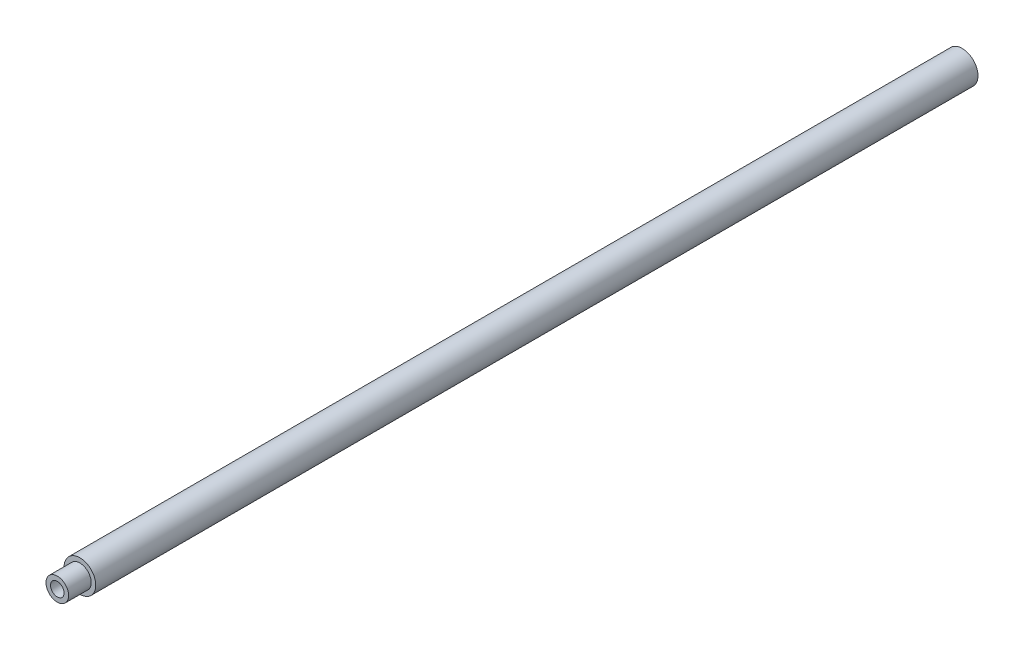
ISO-10303-21;
HEADER;
FILE_DESCRIPTION(('STEP AP214'),'2;1');
FILE_NAME('part.step','',(''),(''),'','','');
FILE_SCHEMA(('AUTOMOTIVE_DESIGN { 1 0 10303 214 1 1 1 1 }'));
ENDSEC;
DATA;
#1=APPLICATION_CONTEXT('core data for automotive mechanical design processes');
#2=APPLICATION_PROTOCOL_DEFINITION('international standard','automotive_design',2000,#1);
#3=PRODUCT_CONTEXT('',#1,'mechanical');
#4=PRODUCT('Part','Part','',(#3));
#5=PRODUCT_RELATED_PRODUCT_CATEGORY('part','',(#4));
#6=PRODUCT_DEFINITION_FORMATION('','',#4);
#7=PRODUCT_DEFINITION_CONTEXT('part definition',#1,'design');
#8=PRODUCT_DEFINITION('design','',#6,#7);
#9=PRODUCT_DEFINITION_SHAPE('','',#8);
#10=(LENGTH_UNIT() NAMED_UNIT(*) SI_UNIT(.MILLI.,.METRE.));
#11=(NAMED_UNIT(*) PLANE_ANGLE_UNIT() SI_UNIT($,.RADIAN.));
#12=(NAMED_UNIT(*) SI_UNIT($,.STERADIAN.) SOLID_ANGLE_UNIT());
#13=UNCERTAINTY_MEASURE_WITH_UNIT(LENGTH_MEASURE(1.E-05),#10,'distance_accuracy_value','');
#14=(GEOMETRIC_REPRESENTATION_CONTEXT(3) GLOBAL_UNCERTAINTY_ASSIGNED_CONTEXT((#13)) GLOBAL_UNIT_ASSIGNED_CONTEXT((#10,
#11,#12)) REPRESENTATION_CONTEXT('',''));
#15=CARTESIAN_POINT('',(0.,0.,0.));
#16=DIRECTION('',(0.,0.,1.));
#17=DIRECTION('',(1.,0.,0.));
#18=AXIS2_PLACEMENT_3D('',#15,#16,#17);
#19=CARTESIAN_POINT('',(0.,0.,200.));
#20=DIRECTION('',(0.,0.,-1.));
#21=DIRECTION('',(-1.,0.,0.));
#22=AXIS2_PLACEMENT_3D('',#19,#20,#21);
#23=CYLINDRICAL_SURFACE('',#22,3.5);
#24=CARTESIAN_POINT('',(0.,0.,0.));
#25=DIRECTION('',(0.,0.,1.));
#26=DIRECTION('',(1.,0.,0.));
#27=AXIS2_PLACEMENT_3D('',#24,#25,#26);
#28=CIRCLE('',#27,3.5);
#29=CARTESIAN_POINT('',(3.5,0.,0.));
#30=VERTEX_POINT('',#29);
#31=EDGE_CURVE('E10',#30,#30,#28,.T.);
#32=ORIENTED_EDGE('',*,*,#31,.T.);
#33=EDGE_LOOP('',(#32));
#34=FACE_BOUND('',#33,.T.);
#35=CARTESIAN_POINT('',(0.,0.,195.));
#36=DIRECTION('',(0.,0.,1.));
#37=DIRECTION('',(1.,0.,0.));
#38=AXIS2_PLACEMENT_3D('',#35,#36,#37);
#39=CIRCLE('',#38,3.5);
#40=CARTESIAN_POINT('',(3.5,0.,195.));
#41=VERTEX_POINT('',#40);
#42=EDGE_CURVE('E46',#41,#41,#39,.T.);
#43=ORIENTED_EDGE('',*,*,#42,.F.);
#44=EDGE_LOOP('',(#43));
#45=FACE_BOUND('',#44,.T.);
#46=ADVANCED_FACE('F31',(#34,#45),#23,.T.);
#47=CARTESIAN_POINT('',(0.,0.,0.));
#48=DIRECTION('',(0.,0.,1.));
#49=DIRECTION('',(1.,0.,0.));
#50=AXIS2_PLACEMENT_3D('',#47,#48,#49);
#51=PLANE('',#50);
#52=CARTESIAN_POINT('',(0.,0.,0.));
#53=DIRECTION('',(0.,0.,-1.));
#54=DIRECTION('',(-1.,0.,0.));
#55=AXIS2_PLACEMENT_3D('',#52,#53,#54);
#56=CIRCLE('',#55,2.);
#57=CARTESIAN_POINT('',(-2.,0.,0.));
#58=VERTEX_POINT('',#57);
#59=EDGE_CURVE('E41',#58,#58,#56,.T.);
#60=ORIENTED_EDGE('',*,*,#59,.F.);
#61=EDGE_LOOP('',(#60));
#62=FACE_BOUND('',#61,.T.);
#63=ORIENTED_EDGE('',*,*,#31,.F.);
#64=EDGE_LOOP('',(#63));
#65=FACE_BOUND('',#64,.T.);
#66=ADVANCED_FACE('F89',(#62,#65),#51,.F.);
#67=CARTESIAN_POINT('',(0.,0.,15.));
#68=DIRECTION('',(0.,0.,-1.));
#69=DIRECTION('',(-1.,0.,0.));
#70=AXIS2_PLACEMENT_3D('',#67,#68,#69);
#71=CYLINDRICAL_SURFACE('',#70,2.);
#72=CARTESIAN_POINT('',(0.,0.,15.));
#73=DIRECTION('',(0.,0.,-1.));
#74=DIRECTION('',(-1.,0.,0.));
#75=AXIS2_PLACEMENT_3D('',#72,#73,#74);
#76=CIRCLE('',#75,2.);
#77=CARTESIAN_POINT('',(-2.,0.,15.));
#78=VERTEX_POINT('',#77);
#79=EDGE_CURVE('E37',#78,#78,#76,.T.);
#80=ORIENTED_EDGE('',*,*,#79,.F.);
#81=EDGE_LOOP('',(#80));
#82=FACE_BOUND('',#81,.T.);
#83=ORIENTED_EDGE('',*,*,#59,.T.);
#84=EDGE_LOOP('',(#83));
#85=FACE_BOUND('',#84,.T.);
#86=ADVANCED_FACE('F95',(#82,#85),#71,.F.);
#87=CARTESIAN_POINT('',(0.,0.,15.));
#88=DIRECTION('',(0.,0.,-1.));
#89=DIRECTION('',(-1.,0.,0.));
#90=AXIS2_PLACEMENT_3D('',#87,#88,#89);
#91=PLANE('',#90);
#92=ORIENTED_EDGE('',*,*,#79,.T.);
#93=EDGE_LOOP('',(#92));
#94=FACE_BOUND('',#93,.T.);
#95=ADVANCED_FACE('F85',(#94),#91,.T.);
#96=CARTESIAN_POINT('',(0.,0.,195.));
#97=DIRECTION('',(0.,0.,1.));
#98=DIRECTION('',(1.,0.,0.));
#99=AXIS2_PLACEMENT_3D('',#96,#97,#98);
#100=PLANE('',#99);
#101=CARTESIAN_POINT('',(0.,0.,195.));
#102=DIRECTION('',(0.,0.,1.));
#103=DIRECTION('',(1.,0.,0.));
#104=AXIS2_PLACEMENT_3D('',#101,#102,#103);
#105=CIRCLE('',#104,2.5);
#106=CARTESIAN_POINT('',(2.5,0.,195.));
#107=VERTEX_POINT('',#106);
#108=EDGE_CURVE('E50',#107,#107,#105,.T.);
#109=ORIENTED_EDGE('',*,*,#108,.F.);
#110=EDGE_LOOP('',(#109));
#111=FACE_BOUND('',#110,.T.);
#112=ORIENTED_EDGE('',*,*,#42,.T.);
#113=EDGE_LOOP('',(#112));
#114=FACE_BOUND('',#113,.T.);
#115=ADVANCED_FACE('F79',(#111,#114),#100,.T.);
#116=CARTESIAN_POINT('',(0.,0.,195.));
#117=DIRECTION('',(0.,0.,1.));
#118=DIRECTION('',(1.,0.,0.));
#119=AXIS2_PLACEMENT_3D('',#116,#117,#118);
#120=CYLINDRICAL_SURFACE('',#119,2.5);
#121=ORIENTED_EDGE('',*,*,#108,.T.);
#122=EDGE_LOOP('',(#121));
#123=FACE_BOUND('',#122,.T.);
#124=CARTESIAN_POINT('',(0.,0.,200.));
#125=DIRECTION('',(0.,0.,1.));
#126=DIRECTION('',(1.,0.,0.));
#127=AXIS2_PLACEMENT_3D('',#124,#125,#126);
#128=CIRCLE('',#127,2.5);
#129=CARTESIAN_POINT('',(2.5,0.,200.));
#130=VERTEX_POINT('',#129);
#131=EDGE_CURVE('E51',#130,#130,#128,.T.);
#132=ORIENTED_EDGE('',*,*,#131,.F.);
#133=EDGE_LOOP('',(#132));
#134=FACE_BOUND('',#133,.T.);
#135=ADVANCED_FACE('F74',(#123,#134),#120,.T.);
#136=CARTESIAN_POINT('',(0.,0.,200.));
#137=DIRECTION('',(0.,0.,1.));
#138=DIRECTION('',(1.,0.,0.));
#139=AXIS2_PLACEMENT_3D('',#136,#137,#138);
#140=PLANE('',#139);
#141=CARTESIAN_POINT('',(0.,0.,200.));
#142=DIRECTION('',(0.,0.,1.));
#143=DIRECTION('',(1.,0.,0.));
#144=AXIS2_PLACEMENT_3D('',#141,#142,#143);
#145=CIRCLE('',#144,1.5);
#146=CARTESIAN_POINT('',(1.5,0.,200.));
#147=VERTEX_POINT('',#146);
#148=EDGE_CURVE('E57',#147,#147,#145,.T.);
#149=ORIENTED_EDGE('',*,*,#148,.F.);
#150=EDGE_LOOP('',(#149));
#151=FACE_BOUND('',#150,.T.);
#152=ORIENTED_EDGE('',*,*,#131,.T.);
#153=EDGE_LOOP('',(#152));
#154=FACE_BOUND('',#153,.T.);
#155=ADVANCED_FACE('F68',(#151,#154),#140,.T.);
#156=CARTESIAN_POINT('',(0.,0.,180.));
#157=DIRECTION('',(0.,0.,1.));
#158=DIRECTION('',(1.,0.,0.));
#159=AXIS2_PLACEMENT_3D('',#156,#157,#158);
#160=CYLINDRICAL_SURFACE('',#159,1.5);
#161=CARTESIAN_POINT('',(0.,0.,180.));
#162=DIRECTION('',(0.,0.,1.));
#163=DIRECTION('',(1.,0.,0.));
#164=AXIS2_PLACEMENT_3D('',#161,#162,#163);
#165=CIRCLE('',#164,1.5);
#166=CARTESIAN_POINT('',(1.5,0.,180.));
#167=VERTEX_POINT('',#166);
#168=EDGE_CURVE('E54',#167,#167,#165,.T.);
#169=ORIENTED_EDGE('',*,*,#168,.F.);
#170=EDGE_LOOP('',(#169));
#171=FACE_BOUND('',#170,.T.);
#172=ORIENTED_EDGE('',*,*,#148,.T.);
#173=EDGE_LOOP('',(#172));
#174=FACE_BOUND('',#173,.T.);
#175=ADVANCED_FACE('F65',(#171,#174),#160,.F.);
#176=CARTESIAN_POINT('',(0.,0.,180.));
#177=DIRECTION('',(0.,0.,1.));
#178=DIRECTION('',(1.,0.,0.));
#179=AXIS2_PLACEMENT_3D('',#176,#177,#178);
#180=PLANE('',#179);
#181=ORIENTED_EDGE('',*,*,#168,.T.);
#182=EDGE_LOOP('',(#181));
#183=FACE_BOUND('',#182,.T.);
#184=ADVANCED_FACE('F63',(#183),#180,.T.);
#185=CLOSED_SHELL('',(#46,#66,#86,#95,#115,#135,#155,#175,#184));
#186=MANIFOLD_SOLID_BREP('B2',#185);
#187=ADVANCED_BREP_SHAPE_REPRESENTATION('',(#18,#186),#14);
#188=SHAPE_DEFINITION_REPRESENTATION(#9,#187);
ENDSEC;
END-ISO-10303-21;
